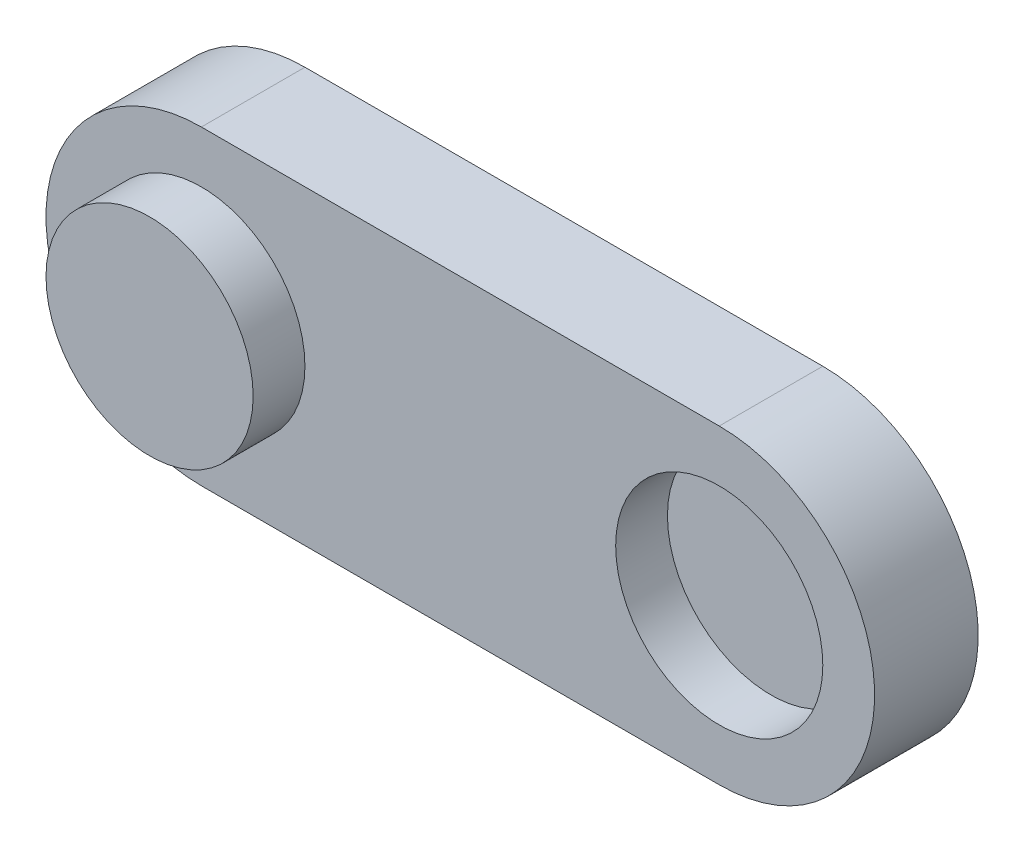
ISO-10303-21;
HEADER;
FILE_DESCRIPTION(('STEP AP214'),'2;1');
FILE_NAME('part.step','',(''),(''),'','','');
FILE_SCHEMA(('AUTOMOTIVE_DESIGN { 1 0 10303 214 1 1 1 1 }'));
ENDSEC;
DATA;
#1=APPLICATION_CONTEXT('core data for automotive mechanical design processes');
#2=APPLICATION_PROTOCOL_DEFINITION('international standard','automotive_design',2000,#1);
#3=PRODUCT_CONTEXT('',#1,'mechanical');
#4=PRODUCT('Part','Part','',(#3));
#5=PRODUCT_RELATED_PRODUCT_CATEGORY('part','',(#4));
#6=PRODUCT_DEFINITION_FORMATION('','',#4);
#7=PRODUCT_DEFINITION_CONTEXT('part definition',#1,'design');
#8=PRODUCT_DEFINITION('design','',#6,#7);
#9=PRODUCT_DEFINITION_SHAPE('','',#8);
#10=(LENGTH_UNIT() NAMED_UNIT(*) SI_UNIT(.MILLI.,.METRE.));
#11=(NAMED_UNIT(*) PLANE_ANGLE_UNIT() SI_UNIT($,.RADIAN.));
#12=(NAMED_UNIT(*) SI_UNIT($,.STERADIAN.) SOLID_ANGLE_UNIT());
#13=UNCERTAINTY_MEASURE_WITH_UNIT(LENGTH_MEASURE(1.E-05),#10,'distance_accuracy_value','');
#14=(GEOMETRIC_REPRESENTATION_CONTEXT(3) GLOBAL_UNCERTAINTY_ASSIGNED_CONTEXT((#13)) GLOBAL_UNIT_ASSIGNED_CONTEXT((#10,
#11,#12)) REPRESENTATION_CONTEXT('',''));
#15=CARTESIAN_POINT('',(0.,0.,0.));
#16=DIRECTION('',(0.,0.,1.));
#17=DIRECTION('',(1.,0.,0.));
#18=AXIS2_PLACEMENT_3D('',#15,#16,#17);
#19=CARTESIAN_POINT('',(0.,0.,20.));
#20=DIRECTION('',(0.,0.,-1.));
#21=DIRECTION('',(-1.,0.,0.));
#22=AXIS2_PLACEMENT_3D('',#19,#20,#21);
#23=CYLINDRICAL_SURFACE('',#22,30.);
#24=CARTESIAN_POINT('',(0.,0.,0.));
#25=DIRECTION('',(0.,0.,1.));
#26=DIRECTION('',(1.,0.,0.));
#27=AXIS2_PLACEMENT_3D('',#24,#25,#26);
#28=CIRCLE('',#27,30.);
#29=CARTESIAN_POINT('',(0.,30.,0.));
#30=VERTEX_POINT('',#29);
#31=CARTESIAN_POINT('',(0.,-30.,0.));
#32=VERTEX_POINT('',#31);
#33=EDGE_CURVE('E106',#30,#32,#28,.T.);
#34=ORIENTED_EDGE('',*,*,#33,.T.);
#35=DIRECTION('',(0.,0.,-1.));
#36=VECTOR('',#35,1.);
#37=CARTESIAN_POINT('',(0.,-30.,20.));
#38=LINE('',#37,#36);
#39=CARTESIAN_POINT('',(0.,-30.,20.));
#40=VERTEX_POINT('',#39);
#41=EDGE_CURVE('E11',#40,#32,#38,.T.);
#42=ORIENTED_EDGE('',*,*,#41,.F.);
#43=CARTESIAN_POINT('',(0.,0.,20.));
#44=DIRECTION('',(0.,0.,1.));
#45=DIRECTION('',(1.,0.,0.));
#46=AXIS2_PLACEMENT_3D('',#43,#44,#45);
#47=CIRCLE('',#46,30.);
#48=CARTESIAN_POINT('',(0.,30.,20.));
#49=VERTEX_POINT('',#48);
#50=EDGE_CURVE('E90',#49,#40,#47,.T.);
#51=ORIENTED_EDGE('',*,*,#50,.F.);
#52=DIRECTION('',(0.,0.,-1.));
#53=VECTOR('',#52,1.);
#54=CARTESIAN_POINT('',(0.,30.,20.));
#55=LINE('',#54,#53);
#56=EDGE_CURVE('E102',#49,#30,#55,.T.);
#57=ORIENTED_EDGE('',*,*,#56,.T.);
#58=EDGE_LOOP('',(#34,#42,#51,#57));
#59=FACE_BOUND('',#58,.T.);
#60=ADVANCED_FACE('F38',(#59),#23,.T.);
#61=CARTESIAN_POINT('',(0.,-30.,20.));
#62=DIRECTION('',(0.,1.,0.));
#63=DIRECTION('',(0.,0.,1.));
#64=AXIS2_PLACEMENT_3D('',#61,#62,#63);
#65=PLANE('',#64);
#66=DIRECTION('',(1.,0.,0.));
#67=VECTOR('',#66,1.);
#68=CARTESIAN_POINT('',(0.,-30.,0.));
#69=LINE('',#68,#67);
#70=CARTESIAN_POINT('',(100.,-30.,0.));
#71=VERTEX_POINT('',#70);
#72=EDGE_CURVE('E95',#32,#71,#69,.T.);
#73=ORIENTED_EDGE('',*,*,#72,.T.);
#74=DIRECTION('',(0.,0.,-1.));
#75=VECTOR('',#74,1.);
#76=CARTESIAN_POINT('',(100.,-30.,20.));
#77=LINE('',#76,#75);
#78=CARTESIAN_POINT('',(100.,-30.,20.));
#79=VERTEX_POINT('',#78);
#80=EDGE_CURVE('E47',#79,#71,#77,.T.);
#81=ORIENTED_EDGE('',*,*,#80,.F.);
#82=DIRECTION('',(1.,0.,0.));
#83=VECTOR('',#82,1.);
#84=CARTESIAN_POINT('',(0.,-30.,20.));
#85=LINE('',#84,#83);
#86=EDGE_CURVE('E85',#40,#79,#85,.T.);
#87=ORIENTED_EDGE('',*,*,#86,.F.);
#88=ORIENTED_EDGE('',*,*,#41,.T.);
#89=EDGE_LOOP('',(#73,#81,#87,#88));
#90=FACE_BOUND('',#89,.T.);
#91=ADVANCED_FACE('F94',(#90),#65,.F.);
#92=CARTESIAN_POINT('',(100.,0.,20.));
#93=DIRECTION('',(0.,0.,-1.));
#94=DIRECTION('',(-1.,0.,0.));
#95=AXIS2_PLACEMENT_3D('',#92,#93,#94);
#96=CYLINDRICAL_SURFACE('',#95,30.);
#97=CARTESIAN_POINT('',(100.,0.,0.));
#98=DIRECTION('',(0.,0.,1.));
#99=DIRECTION('',(1.,0.,0.));
#100=AXIS2_PLACEMENT_3D('',#97,#98,#99);
#101=CIRCLE('',#100,30.);
#102=CARTESIAN_POINT('',(100.,30.,0.));
#103=VERTEX_POINT('',#102);
#104=EDGE_CURVE('E72',#71,#103,#101,.T.);
#105=ORIENTED_EDGE('',*,*,#104,.T.);
#106=DIRECTION('',(0.,0.,-1.));
#107=VECTOR('',#106,1.);
#108=CARTESIAN_POINT('',(100.,30.,20.));
#109=LINE('',#108,#107);
#110=CARTESIAN_POINT('',(100.,30.,20.));
#111=VERTEX_POINT('',#110);
#112=EDGE_CURVE('E97',#111,#103,#109,.T.);
#113=ORIENTED_EDGE('',*,*,#112,.F.);
#114=CARTESIAN_POINT('',(100.,0.,20.));
#115=DIRECTION('',(0.,0.,1.));
#116=DIRECTION('',(1.,0.,0.));
#117=AXIS2_PLACEMENT_3D('',#114,#115,#116);
#118=CIRCLE('',#117,30.);
#119=EDGE_CURVE('E88',#79,#111,#118,.T.);
#120=ORIENTED_EDGE('',*,*,#119,.F.);
#121=ORIENTED_EDGE('',*,*,#80,.T.);
#122=EDGE_LOOP('',(#105,#113,#120,#121));
#123=FACE_BOUND('',#122,.T.);
#124=ADVANCED_FACE('F98',(#123),#96,.T.);
#125=CARTESIAN_POINT('',(0.,30.,20.));
#126=DIRECTION('',(0.,-1.,0.));
#127=DIRECTION('',(0.,0.,-1.));
#128=AXIS2_PLACEMENT_3D('',#125,#126,#127);
#129=PLANE('',#128);
#130=DIRECTION('',(-1.,0.,0.));
#131=VECTOR('',#130,1.);
#132=CARTESIAN_POINT('',(0.,30.,0.));
#133=LINE('',#132,#131);
#134=EDGE_CURVE('E78',#103,#30,#133,.T.);
#135=ORIENTED_EDGE('',*,*,#134,.T.);
#136=ORIENTED_EDGE('',*,*,#56,.F.);
#137=DIRECTION('',(-1.,0.,0.));
#138=VECTOR('',#137,1.);
#139=CARTESIAN_POINT('',(0.,30.,20.));
#140=LINE('',#139,#138);
#141=EDGE_CURVE('E55',#111,#49,#140,.T.);
#142=ORIENTED_EDGE('',*,*,#141,.F.);
#143=ORIENTED_EDGE('',*,*,#112,.T.);
#144=EDGE_LOOP('',(#135,#136,#142,#143));
#145=FACE_BOUND('',#144,.T.);
#146=ADVANCED_FACE('F120',(#145),#129,.F.);
#147=CARTESIAN_POINT('',(0.,0.,20.));
#148=DIRECTION('',(0.,0.,1.));
#149=DIRECTION('',(1.,0.,0.));
#150=AXIS2_PLACEMENT_3D('',#147,#148,#149);
#151=PLANE('',#150);
#152=CARTESIAN_POINT('',(100.,0.,20.));
#153=DIRECTION('',(0.,0.,1.));
#154=DIRECTION('',(1.,0.,0.));
#155=AXIS2_PLACEMENT_3D('',#152,#153,#154);
#156=CIRCLE('',#155,20.);
#157=CARTESIAN_POINT('',(120.,0.,20.));
#158=VERTEX_POINT('',#157);
#159=EDGE_CURVE('E135',#158,#158,#156,.T.);
#160=ORIENTED_EDGE('',*,*,#159,.F.);
#161=EDGE_LOOP('',(#160));
#162=FACE_BOUND('',#161,.T.);
#163=CARTESIAN_POINT('',(0.,0.,20.));
#164=DIRECTION('',(0.,0.,1.));
#165=DIRECTION('',(1.,0.,0.));
#166=AXIS2_PLACEMENT_3D('',#163,#164,#165);
#167=CIRCLE('',#166,20.);
#168=CARTESIAN_POINT('',(20.,0.,20.));
#169=VERTEX_POINT('',#168);
#170=EDGE_CURVE('E127',#169,#169,#167,.T.);
#171=ORIENTED_EDGE('',*,*,#170,.F.);
#172=EDGE_LOOP('',(#171));
#173=FACE_BOUND('',#172,.T.);
#174=ORIENTED_EDGE('',*,*,#50,.T.);
#175=ORIENTED_EDGE('',*,*,#86,.T.);
#176=ORIENTED_EDGE('',*,*,#119,.T.);
#177=ORIENTED_EDGE('',*,*,#141,.T.);
#178=EDGE_LOOP('',(#174,#175,#176,#177));
#179=FACE_BOUND('',#178,.T.);
#180=ADVANCED_FACE('F86',(#162,#173,#179),#151,.T.);
#181=CARTESIAN_POINT('',(0.,0.,0.));
#182=DIRECTION('',(0.,0.,1.));
#183=DIRECTION('',(1.,0.,0.));
#184=AXIS2_PLACEMENT_3D('',#181,#182,#183);
#185=PLANE('',#184);
#186=ORIENTED_EDGE('',*,*,#33,.F.);
#187=ORIENTED_EDGE('',*,*,#134,.F.);
#188=ORIENTED_EDGE('',*,*,#104,.F.);
#189=ORIENTED_EDGE('',*,*,#72,.F.);
#190=EDGE_LOOP('',(#186,#187,#188,#189));
#191=FACE_BOUND('',#190,.T.);
#192=ADVANCED_FACE('F123',(#191),#185,.F.);
#193=CARTESIAN_POINT('',(0.,0.,30.));
#194=DIRECTION('',(0.,0.,-1.));
#195=DIRECTION('',(-1.,0.,0.));
#196=AXIS2_PLACEMENT_3D('',#193,#194,#195);
#197=CYLINDRICAL_SURFACE('',#196,20.);
#198=CARTESIAN_POINT('',(0.,0.,30.));
#199=DIRECTION('',(0.,0.,1.));
#200=DIRECTION('',(1.,0.,0.));
#201=AXIS2_PLACEMENT_3D('',#198,#199,#200);
#202=CIRCLE('',#201,20.);
#203=CARTESIAN_POINT('',(20.,0.,30.));
#204=VERTEX_POINT('',#203);
#205=EDGE_CURVE('E110',#204,#204,#202,.T.);
#206=ORIENTED_EDGE('',*,*,#205,.F.);
#207=EDGE_LOOP('',(#206));
#208=FACE_BOUND('',#207,.T.);
#209=ORIENTED_EDGE('',*,*,#170,.T.);
#210=EDGE_LOOP('',(#209));
#211=FACE_BOUND('',#210,.T.);
#212=ADVANCED_FACE('F157',(#208,#211),#197,.T.);
#213=CARTESIAN_POINT('',(0.,0.,30.));
#214=DIRECTION('',(0.,0.,1.));
#215=DIRECTION('',(1.,0.,0.));
#216=AXIS2_PLACEMENT_3D('',#213,#214,#215);
#217=PLANE('',#216);
#218=ORIENTED_EDGE('',*,*,#205,.T.);
#219=EDGE_LOOP('',(#218));
#220=FACE_BOUND('',#219,.T.);
#221=ADVANCED_FACE('F148',(#220),#217,.T.);
#222=CARTESIAN_POINT('',(100.,0.,10.));
#223=DIRECTION('',(0.,0.,1.));
#224=DIRECTION('',(1.,0.,0.));
#225=AXIS2_PLACEMENT_3D('',#222,#223,#224);
#226=CYLINDRICAL_SURFACE('',#225,20.);
#227=CARTESIAN_POINT('',(100.,0.,10.));
#228=DIRECTION('',(0.,0.,1.));
#229=DIRECTION('',(1.,0.,0.));
#230=AXIS2_PLACEMENT_3D('',#227,#228,#229);
#231=CIRCLE('',#230,20.);
#232=CARTESIAN_POINT('',(120.,0.,10.));
#233=VERTEX_POINT('',#232);
#234=EDGE_CURVE('E131',#233,#233,#231,.T.);
#235=ORIENTED_EDGE('',*,*,#234,.F.);
#236=EDGE_LOOP('',(#235));
#237=FACE_BOUND('',#236,.T.);
#238=ORIENTED_EDGE('',*,*,#159,.T.);
#239=EDGE_LOOP('',(#238));
#240=FACE_BOUND('',#239,.T.);
#241=ADVANCED_FACE('F145',(#237,#240),#226,.F.);
#242=CARTESIAN_POINT('',(100.,0.,10.));
#243=DIRECTION('',(0.,0.,1.));
#244=DIRECTION('',(1.,0.,0.));
#245=AXIS2_PLACEMENT_3D('',#242,#243,#244);
#246=PLANE('',#245);
#247=ORIENTED_EDGE('',*,*,#234,.T.);
#248=EDGE_LOOP('',(#247));
#249=FACE_BOUND('',#248,.T.);
#250=ADVANCED_FACE('F143',(#249),#246,.T.);
#251=CLOSED_SHELL('',(#60,#91,#124,#146,#180,#192,#212,#221,#241,#250));
#252=MANIFOLD_SOLID_BREP('B2',#251);
#253=ADVANCED_BREP_SHAPE_REPRESENTATION('',(#18,#252),#14);
#254=SHAPE_DEFINITION_REPRESENTATION(#9,#253);
ENDSEC;
END-ISO-10303-21;
